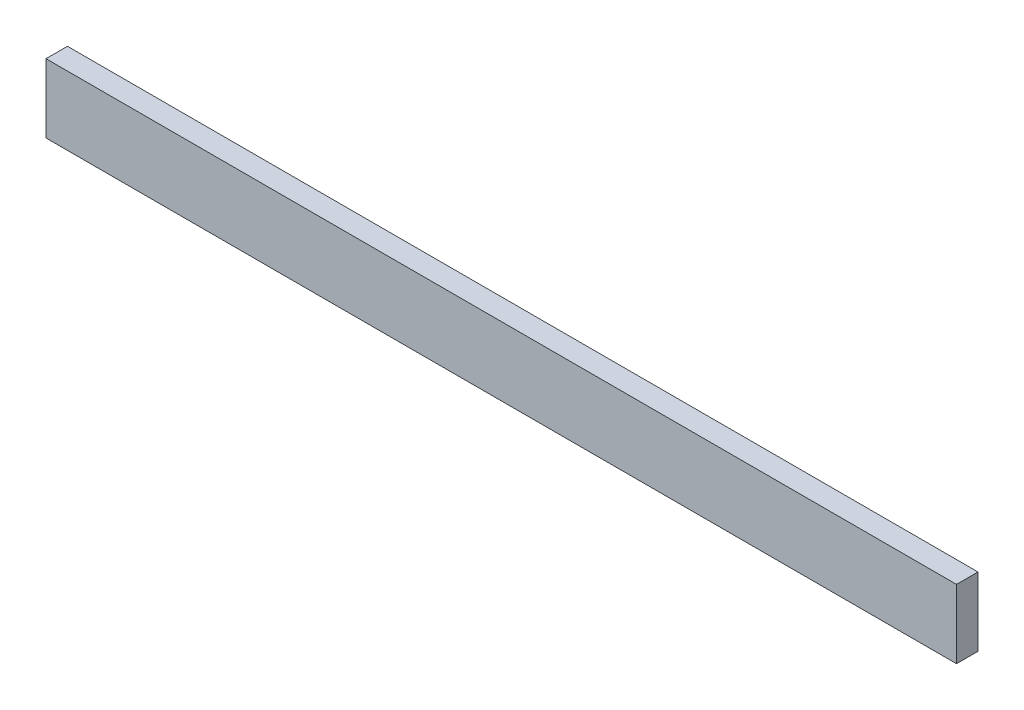
ISO-10303-21;
HEADER;
FILE_DESCRIPTION(('STEP AP214'),'2;1');
FILE_NAME('part.step','',(''),(''),'','','');
FILE_SCHEMA(('AUTOMOTIVE_DESIGN { 1 0 10303 214 1 1 1 1 }'));
ENDSEC;
DATA;
#1=APPLICATION_CONTEXT('core data for automotive mechanical design processes');
#2=APPLICATION_PROTOCOL_DEFINITION('international standard','automotive_design',2000,#1);
#3=PRODUCT_CONTEXT('',#1,'mechanical');
#4=PRODUCT('Part','Part','',(#3));
#5=PRODUCT_RELATED_PRODUCT_CATEGORY('part','',(#4));
#6=PRODUCT_DEFINITION_FORMATION('','',#4);
#7=PRODUCT_DEFINITION_CONTEXT('part definition',#1,'design');
#8=PRODUCT_DEFINITION('design','',#6,#7);
#9=PRODUCT_DEFINITION_SHAPE('','',#8);
#10=(LENGTH_UNIT() NAMED_UNIT(*) SI_UNIT(.MILLI.,.METRE.));
#11=(NAMED_UNIT(*) PLANE_ANGLE_UNIT() SI_UNIT($,.RADIAN.));
#12=(NAMED_UNIT(*) SI_UNIT($,.STERADIAN.) SOLID_ANGLE_UNIT());
#13=UNCERTAINTY_MEASURE_WITH_UNIT(LENGTH_MEASURE(1.E-05),#10,'distance_accuracy_value','');
#14=(GEOMETRIC_REPRESENTATION_CONTEXT(3) GLOBAL_UNCERTAINTY_ASSIGNED_CONTEXT((#13)) GLOBAL_UNIT_ASSIGNED_CONTEXT((#10,
#11,#12)) REPRESENTATION_CONTEXT('',''));
#15=CARTESIAN_POINT('',(0.,0.,0.));
#16=DIRECTION('',(0.,0.,1.));
#17=DIRECTION('',(1.,0.,0.));
#18=AXIS2_PLACEMENT_3D('',#15,#16,#17);
#19=CARTESIAN_POINT('',(530.,80.,12.5));
#20=DIRECTION('',(-1.,0.,0.));
#21=DIRECTION('',(0.,0.,1.));
#22=AXIS2_PLACEMENT_3D('',#19,#20,#21);
#23=PLANE('',#22);
#24=DIRECTION('',(0.,0.,-1.));
#25=VECTOR('',#24,1.);
#26=CARTESIAN_POINT('',(530.,0.,12.5));
#27=LINE('',#26,#25);
#28=CARTESIAN_POINT('',(530.,0.,12.5));
#29=VERTEX_POINT('',#28);
#30=CARTESIAN_POINT('',(530.,0.,-12.5));
#31=VERTEX_POINT('',#30);
#32=EDGE_CURVE('E102',#29,#31,#27,.T.);
#33=ORIENTED_EDGE('',*,*,#32,.T.);
#34=DIRECTION('',(0.,-1.,0.));
#35=VECTOR('',#34,1.);
#36=CARTESIAN_POINT('',(530.,80.,-12.5));
#37=LINE('',#36,#35);
#38=CARTESIAN_POINT('',(530.,80.,-12.5));
#39=VERTEX_POINT('',#38);
#40=EDGE_CURVE('E11',#39,#31,#37,.T.);
#41=ORIENTED_EDGE('',*,*,#40,.F.);
#42=DIRECTION('',(0.,0.,-1.));
#43=VECTOR('',#42,1.);
#44=CARTESIAN_POINT('',(530.,80.,12.5));
#45=LINE('',#44,#43);
#46=CARTESIAN_POINT('',(530.,80.,12.5));
#47=VERTEX_POINT('',#46);
#48=EDGE_CURVE('E90',#47,#39,#45,.T.);
#49=ORIENTED_EDGE('',*,*,#48,.F.);
#50=DIRECTION('',(0.,-1.,0.));
#51=VECTOR('',#50,1.);
#52=CARTESIAN_POINT('',(530.,80.,12.5));
#53=LINE('',#52,#51);
#54=EDGE_CURVE('E98',#47,#29,#53,.T.);
#55=ORIENTED_EDGE('',*,*,#54,.T.);
#56=EDGE_LOOP('',(#33,#41,#49,#55));
#57=FACE_BOUND('',#56,.T.);
#58=ADVANCED_FACE('F39',(#57),#23,.F.);
#59=CARTESIAN_POINT('',(-530.,80.,-12.5));
#60=DIRECTION('',(0.,0.,1.));
#61=DIRECTION('',(1.,0.,0.));
#62=AXIS2_PLACEMENT_3D('',#59,#60,#61);
#63=PLANE('',#62);
#64=DIRECTION('',(-1.,0.,0.));
#65=VECTOR('',#64,1.);
#66=CARTESIAN_POINT('',(-530.,0.,-12.5));
#67=LINE('',#66,#65);
#68=CARTESIAN_POINT('',(-530.,0.,-12.5));
#69=VERTEX_POINT('',#68);
#70=EDGE_CURVE('E94',#31,#69,#67,.T.);
#71=ORIENTED_EDGE('',*,*,#70,.T.);
#72=DIRECTION('',(0.,-1.,0.));
#73=VECTOR('',#72,1.);
#74=CARTESIAN_POINT('',(-530.,80.,-12.5));
#75=LINE('',#74,#73);
#76=CARTESIAN_POINT('',(-530.,80.,-12.5));
#77=VERTEX_POINT('',#76);
#78=EDGE_CURVE('E47',#77,#69,#75,.T.);
#79=ORIENTED_EDGE('',*,*,#78,.F.);
#80=DIRECTION('',(-1.,0.,0.));
#81=VECTOR('',#80,1.);
#82=CARTESIAN_POINT('',(-530.,80.,-12.5));
#83=LINE('',#82,#81);
#84=EDGE_CURVE('E85',#39,#77,#83,.T.);
#85=ORIENTED_EDGE('',*,*,#84,.F.);
#86=ORIENTED_EDGE('',*,*,#40,.T.);
#87=EDGE_LOOP('',(#71,#79,#85,#86));
#88=FACE_BOUND('',#87,.T.);
#89=ADVANCED_FACE('F93',(#88),#63,.F.);
#90=CARTESIAN_POINT('',(-530.,80.,12.5));
#91=DIRECTION('',(1.,0.,0.));
#92=DIRECTION('',(0.,0.,-1.));
#93=AXIS2_PLACEMENT_3D('',#90,#91,#92);
#94=PLANE('',#93);
#95=DIRECTION('',(0.,0.,1.));
#96=VECTOR('',#95,1.);
#97=CARTESIAN_POINT('',(-530.,0.,12.5));
#98=LINE('',#97,#96);
#99=CARTESIAN_POINT('',(-530.,0.,12.5));
#100=VERTEX_POINT('',#99);
#101=EDGE_CURVE('E72',#69,#100,#98,.T.);
#102=ORIENTED_EDGE('',*,*,#101,.T.);
#103=DIRECTION('',(0.,-1.,0.));
#104=VECTOR('',#103,1.);
#105=CARTESIAN_POINT('',(-530.,80.,12.5));
#106=LINE('',#105,#104);
#107=CARTESIAN_POINT('',(-530.,80.,12.5));
#108=VERTEX_POINT('',#107);
#109=EDGE_CURVE('E95',#108,#100,#106,.T.);
#110=ORIENTED_EDGE('',*,*,#109,.F.);
#111=DIRECTION('',(0.,0.,1.));
#112=VECTOR('',#111,1.);
#113=CARTESIAN_POINT('',(-530.,80.,12.5));
#114=LINE('',#113,#112);
#115=EDGE_CURVE('E88',#77,#108,#114,.T.);
#116=ORIENTED_EDGE('',*,*,#115,.F.);
#117=ORIENTED_EDGE('',*,*,#78,.T.);
#118=EDGE_LOOP('',(#102,#110,#116,#117));
#119=FACE_BOUND('',#118,.T.);
#120=ADVANCED_FACE('F96',(#119),#94,.F.);
#121=CARTESIAN_POINT('',(-530.,80.,12.5));
#122=DIRECTION('',(0.,0.,-1.));
#123=DIRECTION('',(-1.,0.,0.));
#124=AXIS2_PLACEMENT_3D('',#121,#122,#123);
#125=PLANE('',#124);
#126=DIRECTION('',(1.,0.,0.));
#127=VECTOR('',#126,1.);
#128=CARTESIAN_POINT('',(-530.,0.,12.5));
#129=LINE('',#128,#127);
#130=EDGE_CURVE('E78',#100,#29,#129,.T.);
#131=ORIENTED_EDGE('',*,*,#130,.T.);
#132=ORIENTED_EDGE('',*,*,#54,.F.);
#133=DIRECTION('',(1.,0.,0.));
#134=VECTOR('',#133,1.);
#135=CARTESIAN_POINT('',(-530.,80.,12.5));
#136=LINE('',#135,#134);
#137=EDGE_CURVE('E55',#108,#47,#136,.T.);
#138=ORIENTED_EDGE('',*,*,#137,.F.);
#139=ORIENTED_EDGE('',*,*,#109,.T.);
#140=EDGE_LOOP('',(#131,#132,#138,#139));
#141=FACE_BOUND('',#140,.T.);
#142=ADVANCED_FACE('F109',(#141),#125,.F.);
#143=CARTESIAN_POINT('',(0.,80.,0.));
#144=DIRECTION('',(0.,-1.,0.));
#145=DIRECTION('',(0.,0.,-1.));
#146=AXIS2_PLACEMENT_3D('',#143,#144,#145);
#147=PLANE('',#146);
#148=ORIENTED_EDGE('',*,*,#48,.T.);
#149=ORIENTED_EDGE('',*,*,#84,.T.);
#150=ORIENTED_EDGE('',*,*,#115,.T.);
#151=ORIENTED_EDGE('',*,*,#137,.T.);
#152=EDGE_LOOP('',(#148,#149,#150,#151));
#153=FACE_BOUND('',#152,.T.);
#154=ADVANCED_FACE('F86',(#153),#147,.F.);
#155=CARTESIAN_POINT('',(0.,0.,0.));
#156=DIRECTION('',(0.,-1.,0.));
#157=DIRECTION('',(0.,0.,-1.));
#158=AXIS2_PLACEMENT_3D('',#155,#156,#157);
#159=PLANE('',#158);
#160=ORIENTED_EDGE('',*,*,#32,.F.);
#161=ORIENTED_EDGE('',*,*,#130,.F.);
#162=ORIENTED_EDGE('',*,*,#101,.F.);
#163=ORIENTED_EDGE('',*,*,#70,.F.);
#164=EDGE_LOOP('',(#160,#161,#162,#163));
#165=FACE_BOUND('',#164,.T.);
#166=ADVANCED_FACE('F112',(#165),#159,.T.);
#167=CLOSED_SHELL('',(#58,#89,#120,#142,#154,#166));
#168=MANIFOLD_SOLID_BREP('B2',#167);
#169=ADVANCED_BREP_SHAPE_REPRESENTATION('',(#18,#168),#14);
#170=SHAPE_DEFINITION_REPRESENTATION(#9,#169);
ENDSEC;
END-ISO-10303-21;
